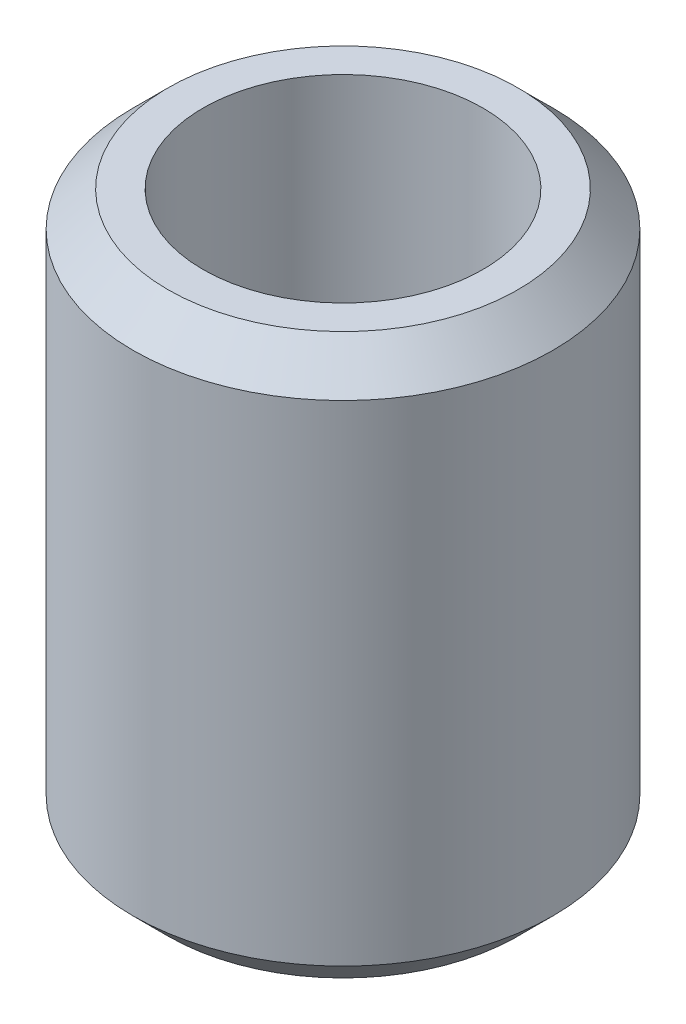
ISO-10303-21;
HEADER;
FILE_DESCRIPTION(('STEP AP214'),'2;1');
FILE_NAME('part.step','',(''),(''),'','','');
FILE_SCHEMA(('AUTOMOTIVE_DESIGN { 1 0 10303 214 1 1 1 1 }'));
ENDSEC;
DATA;
#1=APPLICATION_CONTEXT('core data for automotive mechanical design processes');
#2=APPLICATION_PROTOCOL_DEFINITION('international standard','automotive_design',2000,#1);
#3=PRODUCT_CONTEXT('',#1,'mechanical');
#4=PRODUCT('Part','Part','',(#3));
#5=PRODUCT_RELATED_PRODUCT_CATEGORY('part','',(#4));
#6=PRODUCT_DEFINITION_FORMATION('','',#4);
#7=PRODUCT_DEFINITION_CONTEXT('part definition',#1,'design');
#8=PRODUCT_DEFINITION('design','',#6,#7);
#9=PRODUCT_DEFINITION_SHAPE('','',#8);
#10=(LENGTH_UNIT() NAMED_UNIT(*) SI_UNIT(.MILLI.,.METRE.));
#11=(NAMED_UNIT(*) PLANE_ANGLE_UNIT() SI_UNIT($,.RADIAN.));
#12=(NAMED_UNIT(*) SI_UNIT($,.STERADIAN.) SOLID_ANGLE_UNIT());
#13=UNCERTAINTY_MEASURE_WITH_UNIT(LENGTH_MEASURE(1.E-05),#10,'distance_accuracy_value','');
#14=(GEOMETRIC_REPRESENTATION_CONTEXT(3) GLOBAL_UNCERTAINTY_ASSIGNED_CONTEXT((#13)) GLOBAL_UNIT_ASSIGNED_CONTEXT((#10,
#11,#12)) REPRESENTATION_CONTEXT('',''));
#15=CARTESIAN_POINT('',(0.,0.,0.));
#16=DIRECTION('',(0.,0.,1.));
#17=DIRECTION('',(1.,0.,0.));
#18=AXIS2_PLACEMENT_3D('',#15,#16,#17);
#19=CARTESIAN_POINT('',(0.,4.,0.));
#20=DIRECTION('',(0.,-1.,0.));
#21=DIRECTION('',(0.,0.,-1.));
#22=AXIS2_PLACEMENT_3D('',#19,#20,#21);
#23=CONICAL_SURFACE('',#22,2.5,0.785398163397448);
#24=CARTESIAN_POINT('',(0.,3.5,0.));
#25=DIRECTION('',(0.,1.,0.));
#26=DIRECTION('',(0.,0.,1.));
#27=AXIS2_PLACEMENT_3D('',#24,#25,#26);
#28=CIRCLE('',#27,3.);
#29=CARTESIAN_POINT('',(0.,3.5,3.));
#30=VERTEX_POINT('',#29);
#31=EDGE_CURVE('E53',#30,#30,#28,.T.);
#32=ORIENTED_EDGE('',*,*,#31,.T.);
#33=EDGE_LOOP('',(#32));
#34=FACE_BOUND('',#33,.T.);
#35=CARTESIAN_POINT('',(0.,4.,0.));
#36=DIRECTION('',(0.,1.,0.));
#37=DIRECTION('',(0.,0.,1.));
#38=AXIS2_PLACEMENT_3D('',#35,#36,#37);
#39=CIRCLE('',#38,2.5);
#40=CARTESIAN_POINT('',(0.,4.,2.5));
#41=VERTEX_POINT('',#40);
#42=EDGE_CURVE('E10',#41,#41,#39,.T.);
#43=ORIENTED_EDGE('',*,*,#42,.F.);
#44=EDGE_LOOP('',(#43));
#45=FACE_BOUND('',#44,.T.);
#46=ADVANCED_FACE('F31',(#34,#45),#23,.T.);
#47=CARTESIAN_POINT('',(0.,4.,2.));
#48=DIRECTION('',(0.,1.,0.));
#49=DIRECTION('',(0.,0.,1.));
#50=AXIS2_PLACEMENT_3D('',#47,#48,#49);
#51=PLANE('',#50);
#52=ORIENTED_EDGE('',*,*,#42,.T.);
#53=EDGE_LOOP('',(#52));
#54=FACE_BOUND('',#53,.T.);
#55=CARTESIAN_POINT('',(0.,4.,0.));
#56=DIRECTION('',(0.,1.,0.));
#57=DIRECTION('',(0.,0.,1.));
#58=AXIS2_PLACEMENT_3D('',#55,#56,#57);
#59=CIRCLE('',#58,2.);
#60=CARTESIAN_POINT('',(0.,4.,2.));
#61=VERTEX_POINT('',#60);
#62=EDGE_CURVE('E37',#61,#61,#59,.T.);
#63=ORIENTED_EDGE('',*,*,#62,.F.);
#64=EDGE_LOOP('',(#63));
#65=FACE_BOUND('',#64,.T.);
#66=ADVANCED_FACE('F71',(#54,#65),#51,.T.);
#67=CARTESIAN_POINT('',(0.,7.07878787878788,0.));
#68=DIRECTION('',(0.,1.,0.));
#69=DIRECTION('',(0.,0.,1.));
#70=AXIS2_PLACEMENT_3D('',#67,#68,#69);
#71=CYLINDRICAL_SURFACE('',#70,2.);
#72=ORIENTED_EDGE('',*,*,#62,.T.);
#73=EDGE_LOOP('',(#72));
#74=FACE_BOUND('',#73,.T.);
#75=CARTESIAN_POINT('',(0.,-4.,0.));
#76=DIRECTION('',(0.,1.,0.));
#77=DIRECTION('',(0.,0.,1.));
#78=AXIS2_PLACEMENT_3D('',#75,#76,#77);
#79=CIRCLE('',#78,2.);
#80=CARTESIAN_POINT('',(0.,-4.,2.));
#81=VERTEX_POINT('',#80);
#82=EDGE_CURVE('E41',#81,#81,#79,.T.);
#83=ORIENTED_EDGE('',*,*,#82,.F.);
#84=EDGE_LOOP('',(#83));
#85=FACE_BOUND('',#84,.T.);
#86=ADVANCED_FACE('F75',(#74,#85),#71,.F.);
#87=CARTESIAN_POINT('',(0.,-4.,2.));
#88=DIRECTION('',(0.,-1.,0.));
#89=DIRECTION('',(0.,0.,-1.));
#90=AXIS2_PLACEMENT_3D('',#87,#88,#89);
#91=PLANE('',#90);
#92=ORIENTED_EDGE('',*,*,#82,.T.);
#93=EDGE_LOOP('',(#92));
#94=FACE_BOUND('',#93,.T.);
#95=CARTESIAN_POINT('',(0.,-4.,0.));
#96=DIRECTION('',(0.,1.,0.));
#97=DIRECTION('',(0.,0.,1.));
#98=AXIS2_PLACEMENT_3D('',#95,#96,#97);
#99=CIRCLE('',#98,2.5);
#100=CARTESIAN_POINT('',(0.,-4.,2.5));
#101=VERTEX_POINT('',#100);
#102=EDGE_CURVE('E45',#101,#101,#99,.T.);
#103=ORIENTED_EDGE('',*,*,#102,.F.);
#104=EDGE_LOOP('',(#103));
#105=FACE_BOUND('',#104,.T.);
#106=ADVANCED_FACE('F67',(#94,#105),#91,.T.);
#107=CARTESIAN_POINT('',(0.,-3.5,0.));
#108=DIRECTION('',(0.,1.,0.));
#109=DIRECTION('',(0.,0.,1.));
#110=AXIS2_PLACEMENT_3D('',#107,#108,#109);
#111=CONICAL_SURFACE('',#110,3.,0.785398163397448);
#112=ORIENTED_EDGE('',*,*,#102,.T.);
#113=EDGE_LOOP('',(#112));
#114=FACE_BOUND('',#113,.T.);
#115=CARTESIAN_POINT('',(0.,-3.5,0.));
#116=DIRECTION('',(0.,1.,0.));
#117=DIRECTION('',(0.,0.,1.));
#118=AXIS2_PLACEMENT_3D('',#115,#116,#117);
#119=CIRCLE('',#118,3.);
#120=CARTESIAN_POINT('',(0.,-3.5,3.));
#121=VERTEX_POINT('',#120);
#122=EDGE_CURVE('E50',#121,#121,#119,.T.);
#123=ORIENTED_EDGE('',*,*,#122,.F.);
#124=EDGE_LOOP('',(#123));
#125=FACE_BOUND('',#124,.T.);
#126=ADVANCED_FACE('F61',(#114,#125),#111,.T.);
#127=CARTESIAN_POINT('',(0.,7.07878787878788,0.));
#128=DIRECTION('',(0.,1.,0.));
#129=DIRECTION('',(0.,0.,1.));
#130=AXIS2_PLACEMENT_3D('',#127,#128,#129);
#131=CYLINDRICAL_SURFACE('',#130,3.);
#132=ORIENTED_EDGE('',*,*,#122,.T.);
#133=EDGE_LOOP('',(#132));
#134=FACE_BOUND('',#133,.T.);
#135=ORIENTED_EDGE('',*,*,#31,.F.);
#136=EDGE_LOOP('',(#135));
#137=FACE_BOUND('',#136,.T.);
#138=ADVANCED_FACE('F59',(#134,#137),#131,.T.);
#139=CLOSED_SHELL('',(#46,#66,#86,#106,#126,#138));
#140=MANIFOLD_SOLID_BREP('B2',#139);
#141=ADVANCED_BREP_SHAPE_REPRESENTATION('',(#18,#140),#14);
#142=SHAPE_DEFINITION_REPRESENTATION(#9,#141);
ENDSEC;
END-ISO-10303-21;
